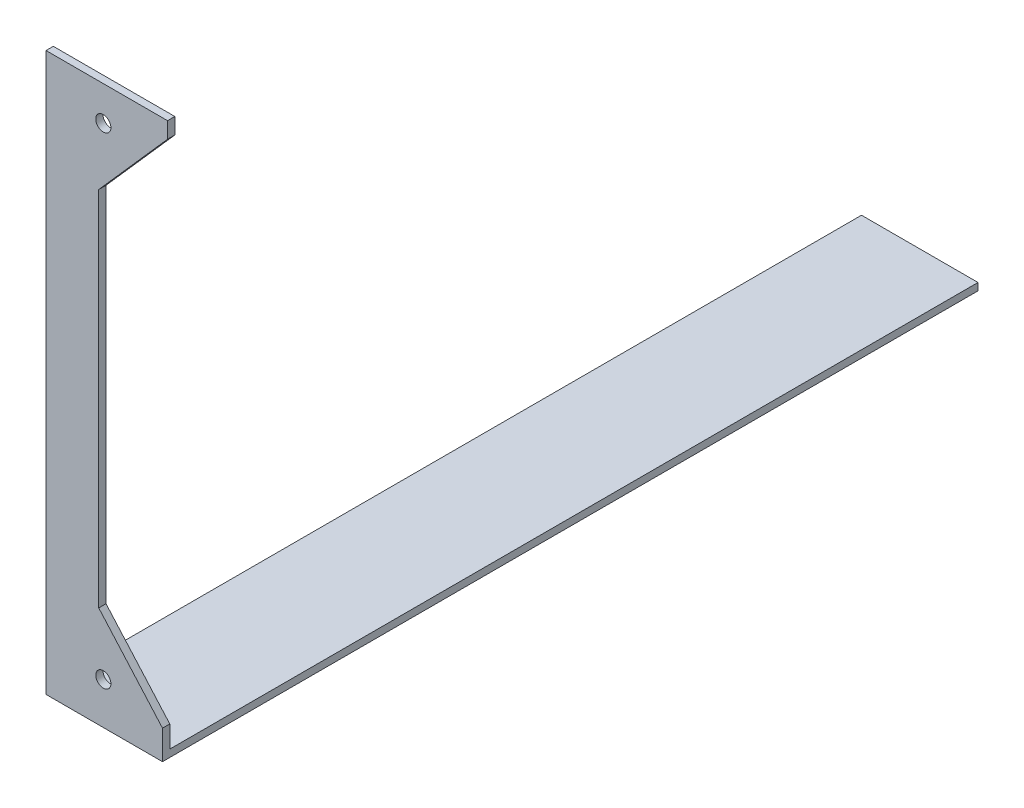
ISO-10303-21;
HEADER;
FILE_DESCRIPTION(('STEP AP214'),'2;1');
FILE_NAME('part.step','',(''),(''),'','','');
FILE_SCHEMA(('AUTOMOTIVE_DESIGN { 1 0 10303 214 1 1 1 1 }'));
ENDSEC;
DATA;
#1=APPLICATION_CONTEXT('core data for automotive mechanical design processes');
#2=APPLICATION_PROTOCOL_DEFINITION('international standard','automotive_design',2000,#1);
#3=PRODUCT_CONTEXT('',#1,'mechanical');
#4=PRODUCT('Part','Part','',(#3));
#5=PRODUCT_RELATED_PRODUCT_CATEGORY('part','',(#4));
#6=PRODUCT_DEFINITION_FORMATION('','',#4);
#7=PRODUCT_DEFINITION_CONTEXT('part definition',#1,'design');
#8=PRODUCT_DEFINITION('design','',#6,#7);
#9=PRODUCT_DEFINITION_SHAPE('','',#8);
#10=(LENGTH_UNIT() NAMED_UNIT(*) SI_UNIT(.MILLI.,.METRE.));
#11=(NAMED_UNIT(*) PLANE_ANGLE_UNIT() SI_UNIT($,.RADIAN.));
#12=(NAMED_UNIT(*) SI_UNIT($,.STERADIAN.) SOLID_ANGLE_UNIT());
#13=UNCERTAINTY_MEASURE_WITH_UNIT(LENGTH_MEASURE(1.E-05),#10,'distance_accuracy_value','');
#14=(GEOMETRIC_REPRESENTATION_CONTEXT(3) GLOBAL_UNCERTAINTY_ASSIGNED_CONTEXT((#13)) GLOBAL_UNIT_ASSIGNED_CONTEXT((#10,
#11,#12)) REPRESENTATION_CONTEXT('',''));
#15=CARTESIAN_POINT('',(0.,0.,0.));
#16=DIRECTION('',(0.,0.,1.));
#17=DIRECTION('',(1.,0.,0.));
#18=AXIS2_PLACEMENT_3D('',#15,#16,#17);
#19=CARTESIAN_POINT('',(-238.5,0.,1.5875));
#20=DIRECTION('',(-1.,0.,0.));
#21=DIRECTION('',(0.,0.,1.));
#22=AXIS2_PLACEMENT_3D('',#19,#20,#21);
#23=PLANE('',#22);
#24=DIRECTION('',(0.,1.,0.));
#25=VECTOR('',#24,1.);
#26=CARTESIAN_POINT('',(-238.5,0.,0.));
#27=LINE('',#26,#25);
#28=CARTESIAN_POINT('',(-238.5,20.5,0.));
#29=VERTEX_POINT('',#28);
#30=CARTESIAN_POINT('',(-238.5,99.5,0.));
#31=VERTEX_POINT('',#30);
#32=EDGE_CURVE('E147',#29,#31,#27,.T.);
#33=ORIENTED_EDGE('',*,*,#32,.T.);
#34=DIRECTION('',(0.,0.,-1.));
#35=VECTOR('',#34,1.);
#36=CARTESIAN_POINT('',(-238.5,99.5,1.5875));
#37=LINE('',#36,#35);
#38=CARTESIAN_POINT('',(-238.5,99.5,1.5875));
#39=VERTEX_POINT('',#38);
#40=EDGE_CURVE('E11',#39,#31,#37,.T.);
#41=ORIENTED_EDGE('',*,*,#40,.F.);
#42=DIRECTION('',(0.,1.,0.));
#43=VECTOR('',#42,1.);
#44=CARTESIAN_POINT('',(-238.5,0.,1.5875));
#45=LINE('',#44,#43);
#46=CARTESIAN_POINT('',(-238.5,20.5,1.5875));
#47=VERTEX_POINT('',#46);
#48=EDGE_CURVE('E172',#47,#39,#45,.T.);
#49=ORIENTED_EDGE('',*,*,#48,.F.);
#50=DIRECTION('',(0.,0.,-1.));
#51=VECTOR('',#50,1.);
#52=CARTESIAN_POINT('',(-238.5,20.5,1.5875));
#53=LINE('',#52,#51);
#54=EDGE_CURVE('E146',#47,#29,#53,.T.);
#55=ORIENTED_EDGE('',*,*,#54,.T.);
#56=EDGE_LOOP('',(#33,#41,#49,#55));
#57=FACE_BOUND('',#56,.T.);
#58=ADVANCED_FACE('F41',(#57),#23,.F.);
#59=CARTESIAN_POINT('',(-183.461089494164,161.877431906615,1.5875));
#60=DIRECTION('',(-0.749837855365093,0.661621637086846,0.));
#61=DIRECTION('',(-0.661621637086846,-0.749837855365093,0.));
#62=AXIS2_PLACEMENT_3D('',#59,#60,#61);
#63=PLANE('',#62);
#64=DIRECTION('',(0.661621637086846,0.749837855365093,0.));
#65=VECTOR('',#64,1.);
#66=CARTESIAN_POINT('',(-183.461089494164,161.877431906615,0.));
#67=LINE('',#66,#65);
#68=CARTESIAN_POINT('',(-223.5,116.5,0.));
#69=VERTEX_POINT('',#68);
#70=EDGE_CURVE('E150',#31,#69,#67,.T.);
#71=ORIENTED_EDGE('',*,*,#70,.T.);
#72=DIRECTION('',(0.,0.,-1.));
#73=VECTOR('',#72,1.);
#74=CARTESIAN_POINT('',(-223.5,116.5,1.5875));
#75=LINE('',#74,#73);
#76=CARTESIAN_POINT('',(-223.5,116.5,1.5875));
#77=VERTEX_POINT('',#76);
#78=EDGE_CURVE('E49',#77,#69,#75,.T.);
#79=ORIENTED_EDGE('',*,*,#78,.F.);
#80=DIRECTION('',(0.661621637086846,0.749837855365093,0.));
#81=VECTOR('',#80,1.);
#82=CARTESIAN_POINT('',(-183.461089494164,161.877431906615,1.5875));
#83=LINE('',#82,#81);
#84=EDGE_CURVE('E94',#39,#77,#83,.T.);
#85=ORIENTED_EDGE('',*,*,#84,.F.);
#86=ORIENTED_EDGE('',*,*,#40,.T.);
#87=EDGE_LOOP('',(#71,#79,#85,#86));
#88=FACE_BOUND('',#87,.T.);
#89=ADVANCED_FACE('F219',(#88),#63,.F.);
#90=CARTESIAN_POINT('',(-223.500000000002,3.54478351433893E-12,1.5875));
#91=DIRECTION('',(-1.,0.,0.));
#92=DIRECTION('',(0.,-1.,0.));
#93=AXIS2_PLACEMENT_3D('',#90,#91,#92);
#94=PLANE('',#93);
#95=DIRECTION('',(0.,1.,0.));
#96=VECTOR('',#95,1.);
#97=CARTESIAN_POINT('',(-223.500000000002,3.54478351433893E-12,0.));
#98=LINE('',#97,#96);
#99=CARTESIAN_POINT('',(-223.5,120.,0.));
#100=VERTEX_POINT('',#99);
#101=EDGE_CURVE('E153',#69,#100,#98,.T.);
#102=ORIENTED_EDGE('',*,*,#101,.T.);
#103=DIRECTION('',(0.,0.,-1.));
#104=VECTOR('',#103,1.);
#105=CARTESIAN_POINT('',(-223.5,120.,1.5875));
#106=LINE('',#105,#104);
#107=CARTESIAN_POINT('',(-223.5,120.,1.5875));
#108=VERTEX_POINT('',#107);
#109=EDGE_CURVE('E115',#108,#100,#106,.T.);
#110=ORIENTED_EDGE('',*,*,#109,.F.);
#111=DIRECTION('',(0.,1.,0.));
#112=VECTOR('',#111,1.);
#113=CARTESIAN_POINT('',(-223.500000000002,3.54478351433893E-12,1.5875));
#114=LINE('',#113,#112);
#115=EDGE_CURVE('E125',#77,#108,#114,.T.);
#116=ORIENTED_EDGE('',*,*,#115,.F.);
#117=ORIENTED_EDGE('',*,*,#78,.T.);
#118=EDGE_LOOP('',(#102,#110,#116,#117));
#119=FACE_BOUND('',#118,.T.);
#120=ADVANCED_FACE('F178',(#119),#94,.F.);
#121=CARTESIAN_POINT('',(0.,120.,1.5875));
#122=DIRECTION('',(0.,1.,0.));
#123=DIRECTION('',(0.,0.,1.));
#124=AXIS2_PLACEMENT_3D('',#121,#122,#123);
#125=PLANE('',#124);
#126=DIRECTION('',(1.,0.,0.));
#127=VECTOR('',#126,1.);
#128=CARTESIAN_POINT('',(0.,120.,0.));
#129=LINE('',#128,#127);
#130=CARTESIAN_POINT('',(-250.,120.,0.));
#131=VERTEX_POINT('',#130);
#132=EDGE_CURVE('E110',#131,#100,#129,.T.);
#133=ORIENTED_EDGE('',*,*,#132,.F.);
#134=DIRECTION('',(0.,0.,-1.));
#135=VECTOR('',#134,1.);
#136=CARTESIAN_POINT('',(-250.,120.,1.5875));
#137=LINE('',#136,#135);
#138=CARTESIAN_POINT('',(-250.,120.,1.5875));
#139=VERTEX_POINT('',#138);
#140=EDGE_CURVE('E105',#139,#131,#137,.T.);
#141=ORIENTED_EDGE('',*,*,#140,.F.);
#142=DIRECTION('',(1.,0.,0.));
#143=VECTOR('',#142,1.);
#144=CARTESIAN_POINT('',(0.,120.,1.5875));
#145=LINE('',#144,#143);
#146=EDGE_CURVE('E108',#139,#108,#145,.T.);
#147=ORIENTED_EDGE('',*,*,#146,.T.);
#148=ORIENTED_EDGE('',*,*,#109,.T.);
#149=EDGE_LOOP('',(#133,#141,#147,#148));
#150=FACE_BOUND('',#149,.T.);
#151=ADVANCED_FACE('F107',(#150),#125,.T.);
#152=CARTESIAN_POINT('',(-250.,0.,1.5875));
#153=DIRECTION('',(-1.,0.,0.));
#154=DIRECTION('',(0.,0.,1.));
#155=AXIS2_PLACEMENT_3D('',#152,#153,#154);
#156=PLANE('',#155);
#157=DIRECTION('',(0.,1.,0.));
#158=VECTOR('',#157,1.);
#159=CARTESIAN_POINT('',(-250.,0.,0.));
#160=LINE('',#159,#158);
#161=CARTESIAN_POINT('',(-250.,0.,0.));
#162=VERTEX_POINT('',#161);
#163=EDGE_CURVE('E157',#162,#131,#160,.T.);
#164=ORIENTED_EDGE('',*,*,#163,.F.);
#165=DIRECTION('',(0.,0.,-1.));
#166=VECTOR('',#165,1.);
#167=CARTESIAN_POINT('',(-250.,0.,1.5875));
#168=LINE('',#167,#166);
#169=CARTESIAN_POINT('',(-250.,0.,-176.2125));
#170=VERTEX_POINT('',#169);
#171=EDGE_CURVE('E186',#162,#170,#168,.T.);
#172=ORIENTED_EDGE('',*,*,#171,.T.);
#173=DIRECTION('',(0.,1.,0.));
#174=VECTOR('',#173,1.);
#175=CARTESIAN_POINT('',(-250.,-1.5875,-176.2125));
#176=LINE('',#175,#174);
#177=CARTESIAN_POINT('',(-250.,-1.5875,-176.2125));
#178=VERTEX_POINT('',#177);
#179=EDGE_CURVE('E189',#178,#170,#176,.T.);
#180=ORIENTED_EDGE('',*,*,#179,.F.);
#181=DIRECTION('',(0.,0.,-1.));
#182=VECTOR('',#181,1.);
#183=CARTESIAN_POINT('',(-250.,-1.5875,1.5875));
#184=LINE('',#183,#182);
#185=CARTESIAN_POINT('',(-250.,-1.5875,1.5875));
#186=VERTEX_POINT('',#185);
#187=EDGE_CURVE('E132',#186,#178,#184,.T.);
#188=ORIENTED_EDGE('',*,*,#187,.F.);
#189=DIRECTION('',(0.,1.,0.));
#190=VECTOR('',#189,1.);
#191=CARTESIAN_POINT('',(-250.,0.,1.5875));
#192=LINE('',#191,#190);
#193=EDGE_CURVE('E122',#186,#139,#192,.T.);
#194=ORIENTED_EDGE('',*,*,#193,.T.);
#195=ORIENTED_EDGE('',*,*,#140,.T.);
#196=EDGE_LOOP('',(#164,#172,#180,#188,#194,#195));
#197=FACE_BOUND('',#196,.T.);
#198=ADVANCED_FACE('F129',(#197),#156,.T.);
#199=CARTESIAN_POINT('',(-224.6,0.,1.5875));
#200=DIRECTION('',(1.,0.,0.));
#201=DIRECTION('',(0.,0.,-1.));
#202=AXIS2_PLACEMENT_3D('',#199,#200,#201);
#203=PLANE('',#202);
#204=DIRECTION('',(0.,-1.,0.));
#205=VECTOR('',#204,1.);
#206=CARTESIAN_POINT('',(-224.6,0.,0.));
#207=LINE('',#206,#205);
#208=CARTESIAN_POINT('',(-224.6,4.74666666666657,0.));
#209=VERTEX_POINT('',#208);
#210=CARTESIAN_POINT('',(-224.6,0.,0.));
#211=VERTEX_POINT('',#210);
#212=EDGE_CURVE('E162',#209,#211,#207,.T.);
#213=ORIENTED_EDGE('',*,*,#212,.F.);
#214=DIRECTION('',(0.,0.,-1.));
#215=VECTOR('',#214,1.);
#216=CARTESIAN_POINT('',(-224.6,4.74666666666657,1.5875));
#217=LINE('',#216,#215);
#218=CARTESIAN_POINT('',(-224.6,4.74666666666657,1.5875));
#219=VERTEX_POINT('',#218);
#220=EDGE_CURVE('E83',#219,#209,#217,.T.);
#221=ORIENTED_EDGE('',*,*,#220,.F.);
#222=DIRECTION('',(0.,-1.,0.));
#223=VECTOR('',#222,1.);
#224=CARTESIAN_POINT('',(-224.6,0.,1.5875));
#225=LINE('',#224,#223);
#226=CARTESIAN_POINT('',(-224.6,-1.5875,1.5875));
#227=VERTEX_POINT('',#226);
#228=EDGE_CURVE('E133',#219,#227,#225,.T.);
#229=ORIENTED_EDGE('',*,*,#228,.T.);
#230=DIRECTION('',(0.,0.,1.));
#231=VECTOR('',#230,1.);
#232=CARTESIAN_POINT('',(-224.6,-1.5875,-176.2125));
#233=LINE('',#232,#231);
#234=CARTESIAN_POINT('',(-224.6,-1.5875,-176.2125));
#235=VERTEX_POINT('',#234);
#236=EDGE_CURVE('E262',#235,#227,#233,.T.);
#237=ORIENTED_EDGE('',*,*,#236,.F.);
#238=DIRECTION('',(0.,1.,0.));
#239=VECTOR('',#238,1.);
#240=CARTESIAN_POINT('',(-224.6,-1.5875,-176.2125));
#241=LINE('',#240,#239);
#242=CARTESIAN_POINT('',(-224.6,0.,-176.2125));
#243=VERTEX_POINT('',#242);
#244=EDGE_CURVE('E151',#235,#243,#241,.T.);
#245=ORIENTED_EDGE('',*,*,#244,.T.);
#246=DIRECTION('',(0.,0.,1.));
#247=VECTOR('',#246,1.);
#248=CARTESIAN_POINT('',(-224.6,0.,-176.2125));
#249=LINE('',#248,#247);
#250=EDGE_CURVE('E196',#243,#211,#249,.T.);
#251=ORIENTED_EDGE('',*,*,#250,.T.);
#252=EDGE_LOOP('',(#213,#221,#229,#237,#245,#251));
#253=FACE_BOUND('',#252,.T.);
#254=ADVANCED_FACE('F231',(#253),#203,.T.);
#255=CARTESIAN_POINT('',(-237.5,7.5,1.5875));
#256=DIRECTION('',(0.,0.,-1.));
#257=DIRECTION('',(-1.,0.,0.));
#258=AXIS2_PLACEMENT_3D('',#255,#256,#257);
#259=CYLINDRICAL_SURFACE('',#258,1.65);
#260=CARTESIAN_POINT('',(-237.5,7.5,1.5875));
#261=DIRECTION('',(0.,0.,1.));
#262=DIRECTION('',(1.,0.,0.));
#263=AXIS2_PLACEMENT_3D('',#260,#261,#262);
#264=CIRCLE('',#263,1.65);
#265=CARTESIAN_POINT('',(-235.85,7.5,1.5875));
#266=VERTEX_POINT('',#265);
#267=EDGE_CURVE('E140',#266,#266,#264,.T.);
#268=ORIENTED_EDGE('',*,*,#267,.T.);
#269=EDGE_LOOP('',(#268));
#270=FACE_BOUND('',#269,.T.);
#271=CARTESIAN_POINT('',(-237.5,7.5,0.));
#272=DIRECTION('',(0.,0.,1.));
#273=DIRECTION('',(1.,0.,0.));
#274=AXIS2_PLACEMENT_3D('',#271,#272,#273);
#275=CIRCLE('',#274,1.65);
#276=CARTESIAN_POINT('',(-235.85,7.5,0.));
#277=VERTEX_POINT('',#276);
#278=EDGE_CURVE('E166',#277,#277,#275,.T.);
#279=ORIENTED_EDGE('',*,*,#278,.F.);
#280=EDGE_LOOP('',(#279));
#281=FACE_BOUND('',#280,.T.);
#282=ADVANCED_FACE('F234',(#270,#281),#259,.F.);
#283=CARTESIAN_POINT('',(-123.928015564202,-109.348249027237,1.5875));
#284=DIRECTION('',(-0.749837855365093,-0.661621637086846,0.));
#285=DIRECTION('',(0.661621637086846,-0.749837855365093,0.));
#286=AXIS2_PLACEMENT_3D('',#283,#284,#285);
#287=PLANE('',#286);
#288=DIRECTION('',(-0.661621637086846,0.749837855365093,0.));
#289=VECTOR('',#288,1.);
#290=CARTESIAN_POINT('',(-123.928015564202,-109.348249027237,0.));
#291=LINE('',#290,#289);
#292=EDGE_CURVE('E86',#209,#29,#291,.T.);
#293=ORIENTED_EDGE('',*,*,#292,.T.);
#294=ORIENTED_EDGE('',*,*,#54,.F.);
#295=DIRECTION('',(-0.661621637086846,0.749837855365093,0.));
#296=VECTOR('',#295,1.);
#297=CARTESIAN_POINT('',(-123.928015564202,-109.348249027237,1.5875));
#298=LINE('',#297,#296);
#299=EDGE_CURVE('E57',#219,#47,#298,.T.);
#300=ORIENTED_EDGE('',*,*,#299,.F.);
#301=ORIENTED_EDGE('',*,*,#220,.T.);
#302=EDGE_LOOP('',(#293,#294,#300,#301));
#303=FACE_BOUND('',#302,.T.);
#304=ADVANCED_FACE('F236',(#303),#287,.F.);
#305=CARTESIAN_POINT('',(-237.5,112.5,1.5875));
#306=DIRECTION('',(0.,0.,-1.));
#307=DIRECTION('',(-1.,0.,0.));
#308=AXIS2_PLACEMENT_3D('',#305,#306,#307);
#309=CYLINDRICAL_SURFACE('',#308,1.65);
#310=CARTESIAN_POINT('',(-237.5,112.5,1.5875));
#311=DIRECTION('',(0.,0.,1.));
#312=DIRECTION('',(1.,0.,0.));
#313=AXIS2_PLACEMENT_3D('',#310,#311,#312);
#314=CIRCLE('',#313,1.65);
#315=CARTESIAN_POINT('',(-235.85,112.5,1.5875));
#316=VERTEX_POINT('',#315);
#317=EDGE_CURVE('E143',#316,#316,#314,.T.);
#318=ORIENTED_EDGE('',*,*,#317,.T.);
#319=EDGE_LOOP('',(#318));
#320=FACE_BOUND('',#319,.T.);
#321=CARTESIAN_POINT('',(-237.5,112.5,0.));
#322=DIRECTION('',(0.,0.,1.));
#323=DIRECTION('',(1.,0.,0.));
#324=AXIS2_PLACEMENT_3D('',#321,#322,#323);
#325=CIRCLE('',#324,1.65);
#326=CARTESIAN_POINT('',(-235.85,112.5,0.));
#327=VERTEX_POINT('',#326);
#328=EDGE_CURVE('E169',#327,#327,#325,.T.);
#329=ORIENTED_EDGE('',*,*,#328,.F.);
#330=EDGE_LOOP('',(#329));
#331=FACE_BOUND('',#330,.T.);
#332=ADVANCED_FACE('F239',(#320,#331),#309,.F.);
#333=CARTESIAN_POINT('',(0.,0.,1.5875));
#334=DIRECTION('',(0.,0.,1.));
#335=DIRECTION('',(1.,0.,0.));
#336=AXIS2_PLACEMENT_3D('',#333,#334,#335);
#337=PLANE('',#336);
#338=ORIENTED_EDGE('',*,*,#48,.T.);
#339=ORIENTED_EDGE('',*,*,#84,.T.);
#340=ORIENTED_EDGE('',*,*,#115,.T.);
#341=ORIENTED_EDGE('',*,*,#146,.F.);
#342=ORIENTED_EDGE('',*,*,#193,.F.);
#343=DIRECTION('',(-1.,0.,0.));
#344=VECTOR('',#343,1.);
#345=CARTESIAN_POINT('',(-224.6,-1.5875,1.5875));
#346=LINE('',#345,#344);
#347=EDGE_CURVE('E270',#227,#186,#346,.T.);
#348=ORIENTED_EDGE('',*,*,#347,.F.);
#349=ORIENTED_EDGE('',*,*,#228,.F.);
#350=ORIENTED_EDGE('',*,*,#299,.T.);
#351=EDGE_LOOP('',(#338,#339,#340,#341,#342,#348,#349,#350));
#352=FACE_BOUND('',#351,.T.);
#353=ORIENTED_EDGE('',*,*,#267,.F.);
#354=EDGE_LOOP('',(#353));
#355=FACE_BOUND('',#354,.T.);
#356=ORIENTED_EDGE('',*,*,#317,.F.);
#357=EDGE_LOOP('',(#356));
#358=FACE_BOUND('',#357,.T.);
#359=ADVANCED_FACE('F118',(#352,#355,#358),#337,.T.);
#360=CARTESIAN_POINT('',(0.,0.,0.));
#361=DIRECTION('',(0.,0.,1.));
#362=DIRECTION('',(1.,0.,0.));
#363=AXIS2_PLACEMENT_3D('',#360,#361,#362);
#364=PLANE('',#363);
#365=ORIENTED_EDGE('',*,*,#32,.F.);
#366=ORIENTED_EDGE('',*,*,#292,.F.);
#367=ORIENTED_EDGE('',*,*,#212,.T.);
#368=DIRECTION('',(-1.,0.,0.));
#369=VECTOR('',#368,1.);
#370=CARTESIAN_POINT('',(0.,0.,0.));
#371=LINE('',#370,#369);
#372=EDGE_CURVE('E159',#211,#162,#371,.T.);
#373=ORIENTED_EDGE('',*,*,#372,.T.);
#374=ORIENTED_EDGE('',*,*,#163,.T.);
#375=ORIENTED_EDGE('',*,*,#132,.T.);
#376=ORIENTED_EDGE('',*,*,#101,.F.);
#377=ORIENTED_EDGE('',*,*,#70,.F.);
#378=EDGE_LOOP('',(#365,#366,#367,#373,#374,#375,#376,#377));
#379=FACE_BOUND('',#378,.T.);
#380=ORIENTED_EDGE('',*,*,#278,.T.);
#381=EDGE_LOOP('',(#380));
#382=FACE_BOUND('',#381,.T.);
#383=ORIENTED_EDGE('',*,*,#328,.T.);
#384=EDGE_LOOP('',(#383));
#385=FACE_BOUND('',#384,.T.);
#386=ADVANCED_FACE('F181',(#379,#382,#385),#364,.F.);
#387=CARTESIAN_POINT('',(-250.,-1.5875,-176.2125));
#388=DIRECTION('',(0.,0.,1.));
#389=DIRECTION('',(1.,0.,0.));
#390=AXIS2_PLACEMENT_3D('',#387,#388,#389);
#391=PLANE('',#390);
#392=DIRECTION('',(1.,0.,0.));
#393=VECTOR('',#392,1.);
#394=CARTESIAN_POINT('',(-250.,0.,-176.2125));
#395=LINE('',#394,#393);
#396=EDGE_CURVE('E202',#170,#243,#395,.T.);
#397=ORIENTED_EDGE('',*,*,#396,.T.);
#398=ORIENTED_EDGE('',*,*,#244,.F.);
#399=DIRECTION('',(1.,0.,0.));
#400=VECTOR('',#399,1.);
#401=CARTESIAN_POINT('',(-250.,-1.5875,-176.2125));
#402=LINE('',#401,#400);
#403=EDGE_CURVE('E195',#178,#235,#402,.T.);
#404=ORIENTED_EDGE('',*,*,#403,.F.);
#405=ORIENTED_EDGE('',*,*,#179,.T.);
#406=EDGE_LOOP('',(#397,#398,#404,#405));
#407=FACE_BOUND('',#406,.T.);
#408=ADVANCED_FACE('F200',(#407),#391,.F.);
#409=CARTESIAN_POINT('',(0.,-1.5875,0.));
#410=DIRECTION('',(0.,-1.,0.));
#411=DIRECTION('',(0.,0.,-1.));
#412=AXIS2_PLACEMENT_3D('',#409,#410,#411);
#413=PLANE('',#412);
#414=ORIENTED_EDGE('',*,*,#403,.T.);
#415=ORIENTED_EDGE('',*,*,#236,.T.);
#416=ORIENTED_EDGE('',*,*,#347,.T.);
#417=ORIENTED_EDGE('',*,*,#187,.T.);
#418=EDGE_LOOP('',(#414,#415,#416,#417));
#419=FACE_BOUND('',#418,.T.);
#420=ADVANCED_FACE('F252',(#419),#413,.T.);
#421=CARTESIAN_POINT('',(0.,0.,0.));
#422=DIRECTION('',(0.,-1.,0.));
#423=DIRECTION('',(0.,0.,-1.));
#424=AXIS2_PLACEMENT_3D('',#421,#422,#423);
#425=PLANE('',#424);
#426=ORIENTED_EDGE('',*,*,#372,.F.);
#427=ORIENTED_EDGE('',*,*,#250,.F.);
#428=ORIENTED_EDGE('',*,*,#396,.F.);
#429=ORIENTED_EDGE('',*,*,#171,.F.);
#430=EDGE_LOOP('',(#426,#427,#428,#429));
#431=FACE_BOUND('',#430,.T.);
#432=ADVANCED_FACE('F206',(#431),#425,.F.);
#433=CLOSED_SHELL('',(#58,#89,#120,#151,#198,#254,#282,#304,#332,#359,#386,#408,#420,#432));
#434=MANIFOLD_SOLID_BREP('B2',#433);
#435=ADVANCED_BREP_SHAPE_REPRESENTATION('',(#18,#434),#14);
#436=SHAPE_DEFINITION_REPRESENTATION(#9,#435);
ENDSEC;
END-ISO-10303-21;
